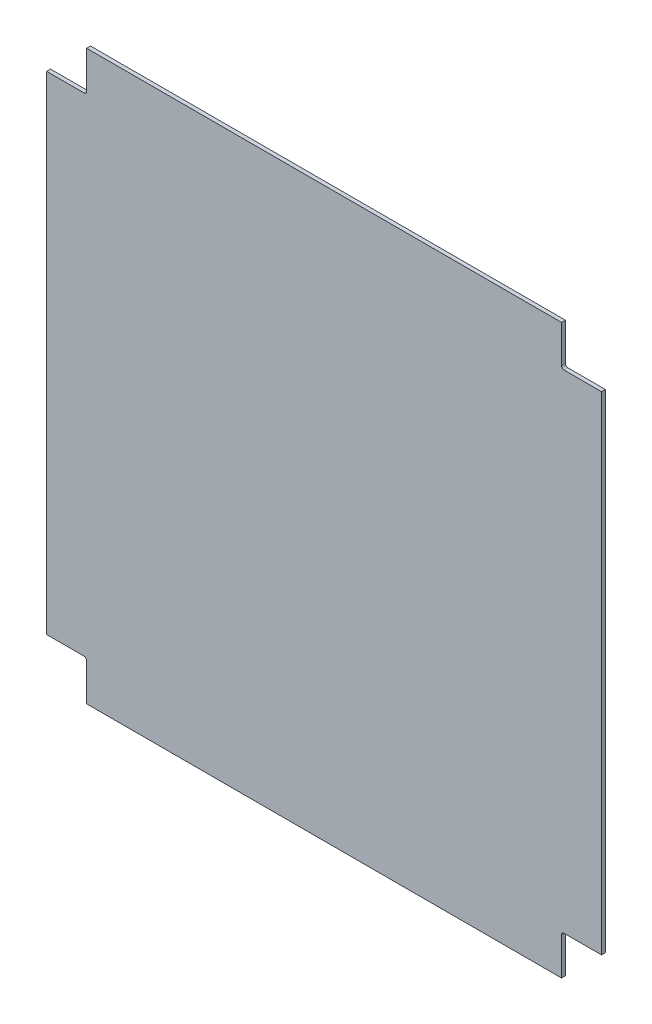
ISO-10303-21;
HEADER;
FILE_DESCRIPTION(('STEP AP214'),'2;1');
FILE_NAME('part.step','',(''),(''),'','','');
FILE_SCHEMA(('AUTOMOTIVE_DESIGN { 1 0 10303 214 1 1 1 1 }'));
ENDSEC;
DATA;
#1=APPLICATION_CONTEXT('core data for automotive mechanical design processes');
#2=APPLICATION_PROTOCOL_DEFINITION('international standard','automotive_design',2000,#1);
#3=PRODUCT_CONTEXT('',#1,'mechanical');
#4=PRODUCT('Part','Part','',(#3));
#5=PRODUCT_RELATED_PRODUCT_CATEGORY('part','',(#4));
#6=PRODUCT_DEFINITION_FORMATION('','',#4);
#7=PRODUCT_DEFINITION_CONTEXT('part definition',#1,'design');
#8=PRODUCT_DEFINITION('design','',#6,#7);
#9=PRODUCT_DEFINITION_SHAPE('','',#8);
#10=(LENGTH_UNIT() NAMED_UNIT(*) SI_UNIT(.MILLI.,.METRE.));
#11=(NAMED_UNIT(*) PLANE_ANGLE_UNIT() SI_UNIT($,.RADIAN.));
#12=(NAMED_UNIT(*) SI_UNIT($,.STERADIAN.) SOLID_ANGLE_UNIT());
#13=UNCERTAINTY_MEASURE_WITH_UNIT(LENGTH_MEASURE(1.E-05),#10,'distance_accuracy_value','');
#14=(GEOMETRIC_REPRESENTATION_CONTEXT(3) GLOBAL_UNCERTAINTY_ASSIGNED_CONTEXT((#13)) GLOBAL_UNIT_ASSIGNED_CONTEXT((#10,
#11,#12)) REPRESENTATION_CONTEXT('',''));
#15=CARTESIAN_POINT('',(0.,0.,0.));
#16=DIRECTION('',(0.,0.,1.));
#17=DIRECTION('',(1.,0.,0.));
#18=AXIS2_PLACEMENT_3D('',#15,#16,#17);
#19=CARTESIAN_POINT('',(0.,-189.,3.));
#20=DIRECTION('',(0.,1.,0.));
#21=DIRECTION('',(0.,0.,1.));
#22=AXIS2_PLACEMENT_3D('',#19,#20,#21);
#23=PLANE('',#22);
#24=DIRECTION('',(1.,0.,0.));
#25=VECTOR('',#24,1.);
#26=CARTESIAN_POINT('',(0.,-189.,0.));
#27=LINE('',#26,#25);
#28=CARTESIAN_POINT('',(-215.,-189.,0.));
#29=VERTEX_POINT('',#28);
#30=CARTESIAN_POINT('',(-186.,-189.,0.));
#31=VERTEX_POINT('',#30);
#32=EDGE_CURVE('E176',#29,#31,#27,.T.);
#33=ORIENTED_EDGE('',*,*,#32,.T.);
#34=DIRECTION('',(0.,0.,-1.));
#35=VECTOR('',#34,1.);
#36=CARTESIAN_POINT('',(-186.,-189.,3.));
#37=LINE('',#36,#35);
#38=CARTESIAN_POINT('',(-186.,-189.,3.));
#39=VERTEX_POINT('',#38);
#40=EDGE_CURVE('E11',#39,#31,#37,.T.);
#41=ORIENTED_EDGE('',*,*,#40,.F.);
#42=DIRECTION('',(1.,0.,0.));
#43=VECTOR('',#42,1.);
#44=CARTESIAN_POINT('',(0.,-189.,3.));
#45=LINE('',#44,#43);
#46=CARTESIAN_POINT('',(-215.,-189.,3.));
#47=VERTEX_POINT('',#46);
#48=EDGE_CURVE('E217',#47,#39,#45,.T.);
#49=ORIENTED_EDGE('',*,*,#48,.F.);
#50=DIRECTION('',(0.,0.,-1.));
#51=VECTOR('',#50,1.);
#52=CARTESIAN_POINT('',(-215.,-189.,3.));
#53=LINE('',#52,#51);
#54=EDGE_CURVE('E172',#47,#29,#53,.T.);
#55=ORIENTED_EDGE('',*,*,#54,.T.);
#56=EDGE_LOOP('',(#33,#41,#49,#55));
#57=FACE_BOUND('',#56,.T.);
#58=ADVANCED_FACE('F33',(#57),#23,.F.);
#59=CARTESIAN_POINT('',(-186.,-191.,3.));
#60=DIRECTION('',(0.,0.,-1.));
#61=DIRECTION('',(-1.,0.,0.));
#62=AXIS2_PLACEMENT_3D('',#59,#60,#61);
#63=CYLINDRICAL_SURFACE('',#62,2.);
#64=CARTESIAN_POINT('',(-186.,-191.,0.));
#65=DIRECTION('',(0.,0.,1.));
#66=DIRECTION('',(1.,0.,0.));
#67=AXIS2_PLACEMENT_3D('',#64,#65,#66);
#68=CIRCLE('',#67,2.);
#69=CARTESIAN_POINT('',(-184.,-191.,0.));
#70=VERTEX_POINT('',#69);
#71=EDGE_CURVE('E179',#31,#70,#68,.F.);
#72=ORIENTED_EDGE('',*,*,#71,.T.);
#73=DIRECTION('',(0.,0.,-1.));
#74=VECTOR('',#73,1.);
#75=CARTESIAN_POINT('',(-184.,-191.,3.));
#76=LINE('',#75,#74);
#77=CARTESIAN_POINT('',(-184.,-191.,3.));
#78=VERTEX_POINT('',#77);
#79=EDGE_CURVE('E41',#78,#70,#76,.T.);
#80=ORIENTED_EDGE('',*,*,#79,.F.);
#81=CARTESIAN_POINT('',(-186.,-191.,3.));
#82=DIRECTION('',(0.,0.,1.));
#83=DIRECTION('',(1.,0.,0.));
#84=AXIS2_PLACEMENT_3D('',#81,#82,#83);
#85=CIRCLE('',#84,2.);
#86=EDGE_CURVE('E112',#39,#78,#85,.F.);
#87=ORIENTED_EDGE('',*,*,#86,.F.);
#88=ORIENTED_EDGE('',*,*,#40,.T.);
#89=EDGE_LOOP('',(#72,#80,#87,#88));
#90=FACE_BOUND('',#89,.T.);
#91=ADVANCED_FACE('F248',(#90),#63,.F.);
#92=CARTESIAN_POINT('',(-184.,0.,3.));
#93=DIRECTION('',(-1.,0.,0.));
#94=DIRECTION('',(0.,0.,1.));
#95=AXIS2_PLACEMENT_3D('',#92,#93,#94);
#96=PLANE('',#95);
#97=DIRECTION('',(0.,1.,0.));
#98=VECTOR('',#97,1.);
#99=CARTESIAN_POINT('',(-184.,0.,0.));
#100=LINE('',#99,#98);
#101=CARTESIAN_POINT('',(-184.,-220.,0.));
#102=VERTEX_POINT('',#101);
#103=EDGE_CURVE('E182',#102,#70,#100,.T.);
#104=ORIENTED_EDGE('',*,*,#103,.F.);
#105=DIRECTION('',(0.,0.,-1.));
#106=VECTOR('',#105,1.);
#107=CARTESIAN_POINT('',(-184.,-220.,3.));
#108=LINE('',#107,#106);
#109=CARTESIAN_POINT('',(-184.,-220.,3.));
#110=VERTEX_POINT('',#109);
#111=EDGE_CURVE('E241',#110,#102,#108,.T.);
#112=ORIENTED_EDGE('',*,*,#111,.F.);
#113=DIRECTION('',(0.,1.,0.));
#114=VECTOR('',#113,1.);
#115=CARTESIAN_POINT('',(-184.,0.,3.));
#116=LINE('',#115,#114);
#117=EDGE_CURVE('E247',#110,#78,#116,.T.);
#118=ORIENTED_EDGE('',*,*,#117,.T.);
#119=ORIENTED_EDGE('',*,*,#79,.T.);
#120=EDGE_LOOP('',(#104,#112,#118,#119));
#121=FACE_BOUND('',#120,.T.);
#122=ADVANCED_FACE('F245',(#121),#96,.T.);
#123=CARTESIAN_POINT('',(0.,-220.,3.));
#124=DIRECTION('',(0.,1.,0.));
#125=DIRECTION('',(-1.,0.,0.));
#126=AXIS2_PLACEMENT_3D('',#123,#124,#125);
#127=PLANE('',#126);
#128=DIRECTION('',(1.,0.,0.));
#129=VECTOR('',#128,1.);
#130=CARTESIAN_POINT('',(0.,-220.,0.));
#131=LINE('',#130,#129);
#132=CARTESIAN_POINT('',(184.,-220.,0.));
#133=VERTEX_POINT('',#132);
#134=EDGE_CURVE('E185',#102,#133,#131,.T.);
#135=ORIENTED_EDGE('',*,*,#134,.T.);
#136=DIRECTION('',(0.,0.,-1.));
#137=VECTOR('',#136,1.);
#138=CARTESIAN_POINT('',(184.,-220.,3.));
#139=LINE('',#138,#137);
#140=CARTESIAN_POINT('',(184.,-220.,3.));
#141=VERTEX_POINT('',#140);
#142=EDGE_CURVE('E238',#141,#133,#139,.T.);
#143=ORIENTED_EDGE('',*,*,#142,.F.);
#144=DIRECTION('',(1.,0.,0.));
#145=VECTOR('',#144,1.);
#146=CARTESIAN_POINT('',(0.,-220.,3.));
#147=LINE('',#146,#145);
#148=EDGE_CURVE('E267',#110,#141,#147,.T.);
#149=ORIENTED_EDGE('',*,*,#148,.F.);
#150=ORIENTED_EDGE('',*,*,#111,.T.);
#151=EDGE_LOOP('',(#135,#143,#149,#150));
#152=FACE_BOUND('',#151,.T.);
#153=ADVANCED_FACE('F257',(#152),#127,.F.);
#154=CARTESIAN_POINT('',(184.,0.,3.));
#155=DIRECTION('',(-1.,0.,0.));
#156=DIRECTION('',(0.,0.,1.));
#157=AXIS2_PLACEMENT_3D('',#154,#155,#156);
#158=PLANE('',#157);
#159=DIRECTION('',(0.,1.,0.));
#160=VECTOR('',#159,1.);
#161=CARTESIAN_POINT('',(184.,0.,0.));
#162=LINE('',#161,#160);
#163=CARTESIAN_POINT('',(184.,-191.,0.));
#164=VERTEX_POINT('',#163);
#165=EDGE_CURVE('E187',#133,#164,#162,.T.);
#166=ORIENTED_EDGE('',*,*,#165,.T.);
#167=DIRECTION('',(0.,0.,-1.));
#168=VECTOR('',#167,1.);
#169=CARTESIAN_POINT('',(184.,-191.,3.));
#170=LINE('',#169,#168);
#171=CARTESIAN_POINT('',(184.,-191.,3.));
#172=VERTEX_POINT('',#171);
#173=EDGE_CURVE('E236',#172,#164,#170,.T.);
#174=ORIENTED_EDGE('',*,*,#173,.F.);
#175=DIRECTION('',(0.,1.,0.));
#176=VECTOR('',#175,1.);
#177=CARTESIAN_POINT('',(184.,0.,3.));
#178=LINE('',#177,#176);
#179=EDGE_CURVE('E263',#141,#172,#178,.T.);
#180=ORIENTED_EDGE('',*,*,#179,.F.);
#181=ORIENTED_EDGE('',*,*,#142,.T.);
#182=EDGE_LOOP('',(#166,#174,#180,#181));
#183=FACE_BOUND('',#182,.T.);
#184=ADVANCED_FACE('F261',(#183),#158,.F.);
#185=CARTESIAN_POINT('',(186.,-191.,3.));
#186=DIRECTION('',(0.,0.,-1.));
#187=DIRECTION('',(-1.,0.,0.));
#188=AXIS2_PLACEMENT_3D('',#185,#186,#187);
#189=CYLINDRICAL_SURFACE('',#188,2.);
#190=CARTESIAN_POINT('',(186.,-191.,0.));
#191=DIRECTION('',(0.,0.,1.));
#192=DIRECTION('',(1.,0.,0.));
#193=AXIS2_PLACEMENT_3D('',#190,#191,#192);
#194=CIRCLE('',#193,2.);
#195=CARTESIAN_POINT('',(186.,-189.,0.));
#196=VERTEX_POINT('',#195);
#197=EDGE_CURVE('E190',#196,#164,#194,.T.);
#198=ORIENTED_EDGE('',*,*,#197,.F.);
#199=DIRECTION('',(0.,0.,-1.));
#200=VECTOR('',#199,1.);
#201=CARTESIAN_POINT('',(186.,-189.,3.));
#202=LINE('',#201,#200);
#203=CARTESIAN_POINT('',(186.,-189.,3.));
#204=VERTEX_POINT('',#203);
#205=EDGE_CURVE('E234',#204,#196,#202,.T.);
#206=ORIENTED_EDGE('',*,*,#205,.F.);
#207=CARTESIAN_POINT('',(186.,-191.,3.));
#208=DIRECTION('',(0.,0.,1.));
#209=DIRECTION('',(1.,0.,0.));
#210=AXIS2_PLACEMENT_3D('',#207,#208,#209);
#211=CIRCLE('',#210,2.);
#212=EDGE_CURVE('E266',#204,#172,#211,.T.);
#213=ORIENTED_EDGE('',*,*,#212,.T.);
#214=ORIENTED_EDGE('',*,*,#173,.T.);
#215=EDGE_LOOP('',(#198,#206,#213,#214));
#216=FACE_BOUND('',#215,.T.);
#217=ADVANCED_FACE('F406',(#216),#189,.F.);
#218=CARTESIAN_POINT('',(0.,-189.,3.));
#219=DIRECTION('',(0.,-1.,0.));
#220=DIRECTION('',(0.,0.,-1.));
#221=AXIS2_PLACEMENT_3D('',#218,#219,#220);
#222=PLANE('',#221);
#223=DIRECTION('',(-1.,0.,0.));
#224=VECTOR('',#223,1.);
#225=CARTESIAN_POINT('',(0.,-189.,0.));
#226=LINE('',#225,#224);
#227=CARTESIAN_POINT('',(215.,-189.,0.));
#228=VERTEX_POINT('',#227);
#229=EDGE_CURVE('E193',#228,#196,#226,.T.);
#230=ORIENTED_EDGE('',*,*,#229,.F.);
#231=DIRECTION('',(0.,0.,-1.));
#232=VECTOR('',#231,1.);
#233=CARTESIAN_POINT('',(215.,-189.,3.));
#234=LINE('',#233,#232);
#235=CARTESIAN_POINT('',(215.,-189.,3.));
#236=VERTEX_POINT('',#235);
#237=EDGE_CURVE('E232',#236,#228,#234,.T.);
#238=ORIENTED_EDGE('',*,*,#237,.F.);
#239=DIRECTION('',(-1.,0.,0.));
#240=VECTOR('',#239,1.);
#241=CARTESIAN_POINT('',(0.,-189.,3.));
#242=LINE('',#241,#240);
#243=EDGE_CURVE('E269',#236,#204,#242,.T.);
#244=ORIENTED_EDGE('',*,*,#243,.T.);
#245=ORIENTED_EDGE('',*,*,#205,.T.);
#246=EDGE_LOOP('',(#230,#238,#244,#245));
#247=FACE_BOUND('',#246,.T.);
#248=ADVANCED_FACE('F396',(#247),#222,.T.);
#249=CARTESIAN_POINT('',(215.,0.,3.));
#250=DIRECTION('',(1.,0.,0.));
#251=DIRECTION('',(0.,1.,0.));
#252=AXIS2_PLACEMENT_3D('',#249,#250,#251);
#253=PLANE('',#252);
#254=DIRECTION('',(0.,-1.,0.));
#255=VECTOR('',#254,1.);
#256=CARTESIAN_POINT('',(215.,0.,0.));
#257=LINE('',#256,#255);
#258=CARTESIAN_POINT('',(215.,189.,0.));
#259=VERTEX_POINT('',#258);
#260=EDGE_CURVE('E196',#259,#228,#257,.T.);
#261=ORIENTED_EDGE('',*,*,#260,.F.);
#262=DIRECTION('',(0.,0.,-1.));
#263=VECTOR('',#262,1.);
#264=CARTESIAN_POINT('',(215.,189.,3.));
#265=LINE('',#264,#263);
#266=CARTESIAN_POINT('',(215.,189.,3.));
#267=VERTEX_POINT('',#266);
#268=EDGE_CURVE('E230',#267,#259,#265,.T.);
#269=ORIENTED_EDGE('',*,*,#268,.F.);
#270=DIRECTION('',(0.,-1.,0.));
#271=VECTOR('',#270,1.);
#272=CARTESIAN_POINT('',(215.,0.,3.));
#273=LINE('',#272,#271);
#274=EDGE_CURVE('E276',#267,#236,#273,.T.);
#275=ORIENTED_EDGE('',*,*,#274,.T.);
#276=ORIENTED_EDGE('',*,*,#237,.T.);
#277=EDGE_LOOP('',(#261,#269,#275,#276));
#278=FACE_BOUND('',#277,.T.);
#279=ADVANCED_FACE('F386',(#278),#253,.T.);
#280=CARTESIAN_POINT('',(0.,189.,3.));
#281=DIRECTION('',(0.,-1.,0.));
#282=DIRECTION('',(0.,0.,-1.));
#283=AXIS2_PLACEMENT_3D('',#280,#281,#282);
#284=PLANE('',#283);
#285=DIRECTION('',(-1.,0.,0.));
#286=VECTOR('',#285,1.);
#287=CARTESIAN_POINT('',(0.,189.,0.));
#288=LINE('',#287,#286);
#289=CARTESIAN_POINT('',(186.,189.,0.));
#290=VERTEX_POINT('',#289);
#291=EDGE_CURVE('E199',#259,#290,#288,.T.);
#292=ORIENTED_EDGE('',*,*,#291,.T.);
#293=DIRECTION('',(0.,0.,-1.));
#294=VECTOR('',#293,1.);
#295=CARTESIAN_POINT('',(186.,189.,3.));
#296=LINE('',#295,#294);
#297=CARTESIAN_POINT('',(186.,189.,3.));
#298=VERTEX_POINT('',#297);
#299=EDGE_CURVE('E227',#298,#290,#296,.T.);
#300=ORIENTED_EDGE('',*,*,#299,.F.);
#301=DIRECTION('',(-1.,0.,0.));
#302=VECTOR('',#301,1.);
#303=CARTESIAN_POINT('',(0.,189.,3.));
#304=LINE('',#303,#302);
#305=EDGE_CURVE('E279',#267,#298,#304,.T.);
#306=ORIENTED_EDGE('',*,*,#305,.F.);
#307=ORIENTED_EDGE('',*,*,#268,.T.);
#308=EDGE_LOOP('',(#292,#300,#306,#307));
#309=FACE_BOUND('',#308,.T.);
#310=ADVANCED_FACE('F376',(#309),#284,.F.);
#311=CARTESIAN_POINT('',(186.,191.,3.));
#312=DIRECTION('',(0.,0.,-1.));
#313=DIRECTION('',(-1.,0.,0.));
#314=AXIS2_PLACEMENT_3D('',#311,#312,#313);
#315=CYLINDRICAL_SURFACE('',#314,2.);
#316=CARTESIAN_POINT('',(186.,191.,0.));
#317=DIRECTION('',(0.,0.,1.));
#318=DIRECTION('',(1.,0.,0.));
#319=AXIS2_PLACEMENT_3D('',#316,#317,#318);
#320=CIRCLE('',#319,2.);
#321=CARTESIAN_POINT('',(184.,191.,0.));
#322=VERTEX_POINT('',#321);
#323=EDGE_CURVE('E201',#290,#322,#320,.F.);
#324=ORIENTED_EDGE('',*,*,#323,.T.);
#325=DIRECTION('',(0.,0.,-1.));
#326=VECTOR('',#325,1.);
#327=CARTESIAN_POINT('',(184.,191.,3.));
#328=LINE('',#327,#326);
#329=CARTESIAN_POINT('',(184.,191.,3.));
#330=VERTEX_POINT('',#329);
#331=EDGE_CURVE('E225',#330,#322,#328,.T.);
#332=ORIENTED_EDGE('',*,*,#331,.F.);
#333=CARTESIAN_POINT('',(186.,191.,3.));
#334=DIRECTION('',(0.,0.,1.));
#335=DIRECTION('',(1.,0.,0.));
#336=AXIS2_PLACEMENT_3D('',#333,#334,#335);
#337=CIRCLE('',#336,2.);
#338=EDGE_CURVE('E281',#298,#330,#337,.F.);
#339=ORIENTED_EDGE('',*,*,#338,.F.);
#340=ORIENTED_EDGE('',*,*,#299,.T.);
#341=EDGE_LOOP('',(#324,#332,#339,#340));
#342=FACE_BOUND('',#341,.T.);
#343=ADVANCED_FACE('F367',(#342),#315,.F.);
#344=CARTESIAN_POINT('',(184.,0.,3.));
#345=DIRECTION('',(1.,0.,0.));
#346=DIRECTION('',(0.,0.,-1.));
#347=AXIS2_PLACEMENT_3D('',#344,#345,#346);
#348=PLANE('',#347);
#349=DIRECTION('',(0.,-1.,0.));
#350=VECTOR('',#349,1.);
#351=CARTESIAN_POINT('',(184.,0.,0.));
#352=LINE('',#351,#350);
#353=CARTESIAN_POINT('',(184.,220.,0.));
#354=VERTEX_POINT('',#353);
#355=EDGE_CURVE('E204',#354,#322,#352,.T.);
#356=ORIENTED_EDGE('',*,*,#355,.F.);
#357=DIRECTION('',(0.,0.,-1.));
#358=VECTOR('',#357,1.);
#359=CARTESIAN_POINT('',(184.,220.,3.));
#360=LINE('',#359,#358);
#361=CARTESIAN_POINT('',(184.,220.,3.));
#362=VERTEX_POINT('',#361);
#363=EDGE_CURVE('E223',#362,#354,#360,.T.);
#364=ORIENTED_EDGE('',*,*,#363,.F.);
#365=DIRECTION('',(0.,-1.,0.));
#366=VECTOR('',#365,1.);
#367=CARTESIAN_POINT('',(184.,0.,3.));
#368=LINE('',#367,#366);
#369=EDGE_CURVE('E283',#362,#330,#368,.T.);
#370=ORIENTED_EDGE('',*,*,#369,.T.);
#371=ORIENTED_EDGE('',*,*,#331,.T.);
#372=EDGE_LOOP('',(#356,#364,#370,#371));
#373=FACE_BOUND('',#372,.T.);
#374=ADVANCED_FACE('F296',(#373),#348,.T.);
#375=CARTESIAN_POINT('',(0.,220.,3.));
#376=DIRECTION('',(0.,1.,0.));
#377=DIRECTION('',(-1.,0.,0.));
#378=AXIS2_PLACEMENT_3D('',#375,#376,#377);
#379=PLANE('',#378);
#380=DIRECTION('',(1.,0.,0.));
#381=VECTOR('',#380,1.);
#382=CARTESIAN_POINT('',(0.,220.,0.));
#383=LINE('',#382,#381);
#384=CARTESIAN_POINT('',(-184.,220.,0.));
#385=VERTEX_POINT('',#384);
#386=EDGE_CURVE('E207',#385,#354,#383,.T.);
#387=ORIENTED_EDGE('',*,*,#386,.F.);
#388=DIRECTION('',(0.,0.,-1.));
#389=VECTOR('',#388,1.);
#390=CARTESIAN_POINT('',(-184.,220.,3.));
#391=LINE('',#390,#389);
#392=CARTESIAN_POINT('',(-184.,220.,3.));
#393=VERTEX_POINT('',#392);
#394=EDGE_CURVE('E221',#393,#385,#391,.T.);
#395=ORIENTED_EDGE('',*,*,#394,.F.);
#396=DIRECTION('',(1.,0.,0.));
#397=VECTOR('',#396,1.);
#398=CARTESIAN_POINT('',(0.,220.,3.));
#399=LINE('',#398,#397);
#400=EDGE_CURVE('E286',#393,#362,#399,.T.);
#401=ORIENTED_EDGE('',*,*,#400,.T.);
#402=ORIENTED_EDGE('',*,*,#363,.T.);
#403=EDGE_LOOP('',(#387,#395,#401,#402));
#404=FACE_BOUND('',#403,.T.);
#405=ADVANCED_FACE('F290',(#404),#379,.T.);
#406=CARTESIAN_POINT('',(-184.,0.,3.));
#407=DIRECTION('',(1.,0.,0.));
#408=DIRECTION('',(0.,0.,-1.));
#409=AXIS2_PLACEMENT_3D('',#406,#407,#408);
#410=PLANE('',#409);
#411=DIRECTION('',(0.,-1.,0.));
#412=VECTOR('',#411,1.);
#413=CARTESIAN_POINT('',(-184.,0.,0.));
#414=LINE('',#413,#412);
#415=CARTESIAN_POINT('',(-184.,191.,0.));
#416=VERTEX_POINT('',#415);
#417=EDGE_CURVE('E210',#385,#416,#414,.T.);
#418=ORIENTED_EDGE('',*,*,#417,.T.);
#419=DIRECTION('',(0.,0.,-1.));
#420=VECTOR('',#419,1.);
#421=CARTESIAN_POINT('',(-184.,191.,3.));
#422=LINE('',#421,#420);
#423=CARTESIAN_POINT('',(-184.,191.,3.));
#424=VERTEX_POINT('',#423);
#425=EDGE_CURVE('E161',#424,#416,#422,.T.);
#426=ORIENTED_EDGE('',*,*,#425,.F.);
#427=DIRECTION('',(0.,-1.,0.));
#428=VECTOR('',#427,1.);
#429=CARTESIAN_POINT('',(-184.,0.,3.));
#430=LINE('',#429,#428);
#431=EDGE_CURVE('E167',#393,#424,#430,.T.);
#432=ORIENTED_EDGE('',*,*,#431,.F.);
#433=ORIENTED_EDGE('',*,*,#394,.T.);
#434=EDGE_LOOP('',(#418,#426,#432,#433));
#435=FACE_BOUND('',#434,.T.);
#436=ADVANCED_FACE('F300',(#435),#410,.F.);
#437=CARTESIAN_POINT('',(-186.,191.,3.));
#438=DIRECTION('',(0.,0.,-1.));
#439=DIRECTION('',(-1.,0.,0.));
#440=AXIS2_PLACEMENT_3D('',#437,#438,#439);
#441=CYLINDRICAL_SURFACE('',#440,2.);
#442=CARTESIAN_POINT('',(-186.,191.,0.));
#443=DIRECTION('',(0.,0.,1.));
#444=DIRECTION('',(1.,0.,0.));
#445=AXIS2_PLACEMENT_3D('',#442,#443,#444);
#446=CIRCLE('',#445,2.);
#447=CARTESIAN_POINT('',(-186.,189.,0.));
#448=VERTEX_POINT('',#447);
#449=EDGE_CURVE('E156',#448,#416,#446,.T.);
#450=ORIENTED_EDGE('',*,*,#449,.F.);
#451=DIRECTION('',(0.,0.,-1.));
#452=VECTOR('',#451,1.);
#453=CARTESIAN_POINT('',(-186.,189.,3.));
#454=LINE('',#453,#452);
#455=CARTESIAN_POINT('',(-186.,189.,3.));
#456=VERTEX_POINT('',#455);
#457=EDGE_CURVE('E151',#456,#448,#454,.T.);
#458=ORIENTED_EDGE('',*,*,#457,.F.);
#459=CARTESIAN_POINT('',(-186.,191.,3.));
#460=DIRECTION('',(0.,0.,1.));
#461=DIRECTION('',(1.,0.,0.));
#462=AXIS2_PLACEMENT_3D('',#459,#460,#461);
#463=CIRCLE('',#462,2.);
#464=EDGE_CURVE('E154',#456,#424,#463,.T.);
#465=ORIENTED_EDGE('',*,*,#464,.T.);
#466=ORIENTED_EDGE('',*,*,#425,.T.);
#467=EDGE_LOOP('',(#450,#458,#465,#466));
#468=FACE_BOUND('',#467,.T.);
#469=ADVANCED_FACE('F153',(#468),#441,.F.);
#470=CARTESIAN_POINT('',(0.,189.,3.));
#471=DIRECTION('',(0.,1.,0.));
#472=DIRECTION('',(0.,0.,1.));
#473=AXIS2_PLACEMENT_3D('',#470,#471,#472);
#474=PLANE('',#473);
#475=DIRECTION('',(1.,0.,0.));
#476=VECTOR('',#475,1.);
#477=CARTESIAN_POINT('',(0.,189.,0.));
#478=LINE('',#477,#476);
#479=CARTESIAN_POINT('',(-215.,189.,0.));
#480=VERTEX_POINT('',#479);
#481=EDGE_CURVE('E214',#480,#448,#478,.T.);
#482=ORIENTED_EDGE('',*,*,#481,.F.);
#483=DIRECTION('',(0.,0.,-1.));
#484=VECTOR('',#483,1.);
#485=CARTESIAN_POINT('',(-215.,189.,3.));
#486=LINE('',#485,#484);
#487=CARTESIAN_POINT('',(-215.,189.,3.));
#488=VERTEX_POINT('',#487);
#489=EDGE_CURVE('E101',#488,#480,#486,.T.);
#490=ORIENTED_EDGE('',*,*,#489,.F.);
#491=DIRECTION('',(1.,0.,0.));
#492=VECTOR('',#491,1.);
#493=CARTESIAN_POINT('',(0.,189.,3.));
#494=LINE('',#493,#492);
#495=EDGE_CURVE('E164',#488,#456,#494,.T.);
#496=ORIENTED_EDGE('',*,*,#495,.T.);
#497=ORIENTED_EDGE('',*,*,#457,.T.);
#498=EDGE_LOOP('',(#482,#490,#496,#497));
#499=FACE_BOUND('',#498,.T.);
#500=ADVANCED_FACE('F170',(#499),#474,.T.);
#501=CARTESIAN_POINT('',(-215.,0.,3.));
#502=DIRECTION('',(1.,0.,0.));
#503=DIRECTION('',(0.,1.,0.));
#504=AXIS2_PLACEMENT_3D('',#501,#502,#503);
#505=PLANE('',#504);
#506=DIRECTION('',(0.,-1.,0.));
#507=VECTOR('',#506,1.);
#508=CARTESIAN_POINT('',(-215.,0.,0.));
#509=LINE('',#508,#507);
#510=EDGE_CURVE('E104',#480,#29,#509,.T.);
#511=ORIENTED_EDGE('',*,*,#510,.T.);
#512=ORIENTED_EDGE('',*,*,#54,.F.);
#513=DIRECTION('',(0.,-1.,0.));
#514=VECTOR('',#513,1.);
#515=CARTESIAN_POINT('',(-215.,0.,3.));
#516=LINE('',#515,#514);
#517=EDGE_CURVE('E49',#488,#47,#516,.T.);
#518=ORIENTED_EDGE('',*,*,#517,.F.);
#519=ORIENTED_EDGE('',*,*,#489,.T.);
#520=EDGE_LOOP('',(#511,#512,#518,#519));
#521=FACE_BOUND('',#520,.T.);
#522=ADVANCED_FACE('F315',(#521),#505,.F.);
#523=CARTESIAN_POINT('',(0.,0.,3.));
#524=DIRECTION('',(0.,0.,1.));
#525=DIRECTION('',(1.,0.,0.));
#526=AXIS2_PLACEMENT_3D('',#523,#524,#525);
#527=PLANE('',#526);
#528=ORIENTED_EDGE('',*,*,#48,.T.);
#529=ORIENTED_EDGE('',*,*,#86,.T.);
#530=ORIENTED_EDGE('',*,*,#117,.F.);
#531=ORIENTED_EDGE('',*,*,#148,.T.);
#532=ORIENTED_EDGE('',*,*,#179,.T.);
#533=ORIENTED_EDGE('',*,*,#212,.F.);
#534=ORIENTED_EDGE('',*,*,#243,.F.);
#535=ORIENTED_EDGE('',*,*,#274,.F.);
#536=ORIENTED_EDGE('',*,*,#305,.T.);
#537=ORIENTED_EDGE('',*,*,#338,.T.);
#538=ORIENTED_EDGE('',*,*,#369,.F.);
#539=ORIENTED_EDGE('',*,*,#400,.F.);
#540=ORIENTED_EDGE('',*,*,#431,.T.);
#541=ORIENTED_EDGE('',*,*,#464,.F.);
#542=ORIENTED_EDGE('',*,*,#495,.F.);
#543=ORIENTED_EDGE('',*,*,#517,.T.);
#544=EDGE_LOOP('',(#528,#529,#530,#531,#532,#533,#534,#535,#536,#537,#538,#539,#540,#541,#542,#543));
#545=FACE_BOUND('',#544,.T.);
#546=ADVANCED_FACE('F163',(#545),#527,.T.);
#547=CARTESIAN_POINT('',(0.,0.,0.));
#548=DIRECTION('',(0.,0.,1.));
#549=DIRECTION('',(1.,0.,0.));
#550=AXIS2_PLACEMENT_3D('',#547,#548,#549);
#551=PLANE('',#550);
#552=ORIENTED_EDGE('',*,*,#32,.F.);
#553=ORIENTED_EDGE('',*,*,#510,.F.);
#554=ORIENTED_EDGE('',*,*,#481,.T.);
#555=ORIENTED_EDGE('',*,*,#449,.T.);
#556=ORIENTED_EDGE('',*,*,#417,.F.);
#557=ORIENTED_EDGE('',*,*,#386,.T.);
#558=ORIENTED_EDGE('',*,*,#355,.T.);
#559=ORIENTED_EDGE('',*,*,#323,.F.);
#560=ORIENTED_EDGE('',*,*,#291,.F.);
#561=ORIENTED_EDGE('',*,*,#260,.T.);
#562=ORIENTED_EDGE('',*,*,#229,.T.);
#563=ORIENTED_EDGE('',*,*,#197,.T.);
#564=ORIENTED_EDGE('',*,*,#165,.F.);
#565=ORIENTED_EDGE('',*,*,#134,.F.);
#566=ORIENTED_EDGE('',*,*,#103,.T.);
#567=ORIENTED_EDGE('',*,*,#71,.F.);
#568=EDGE_LOOP('',(#552,#553,#554,#555,#556,#557,#558,#559,#560,#561,#562,#563,#564,#565,#566,#567));
#569=FACE_BOUND('',#568,.T.);
#570=ADVANCED_FACE('F253',(#569),#551,.F.);
#571=CLOSED_SHELL('',(#58,#91,#122,#153,#184,#217,#248,#279,#310,#343,#374,#405,#436,#469,#500,
#522,#546,#570));
#572=MANIFOLD_SOLID_BREP('B2',#571);
#573=ADVANCED_BREP_SHAPE_REPRESENTATION('',(#18,#572),#14);
#574=SHAPE_DEFINITION_REPRESENTATION(#9,#573);
ENDSEC;
END-ISO-10303-21;
